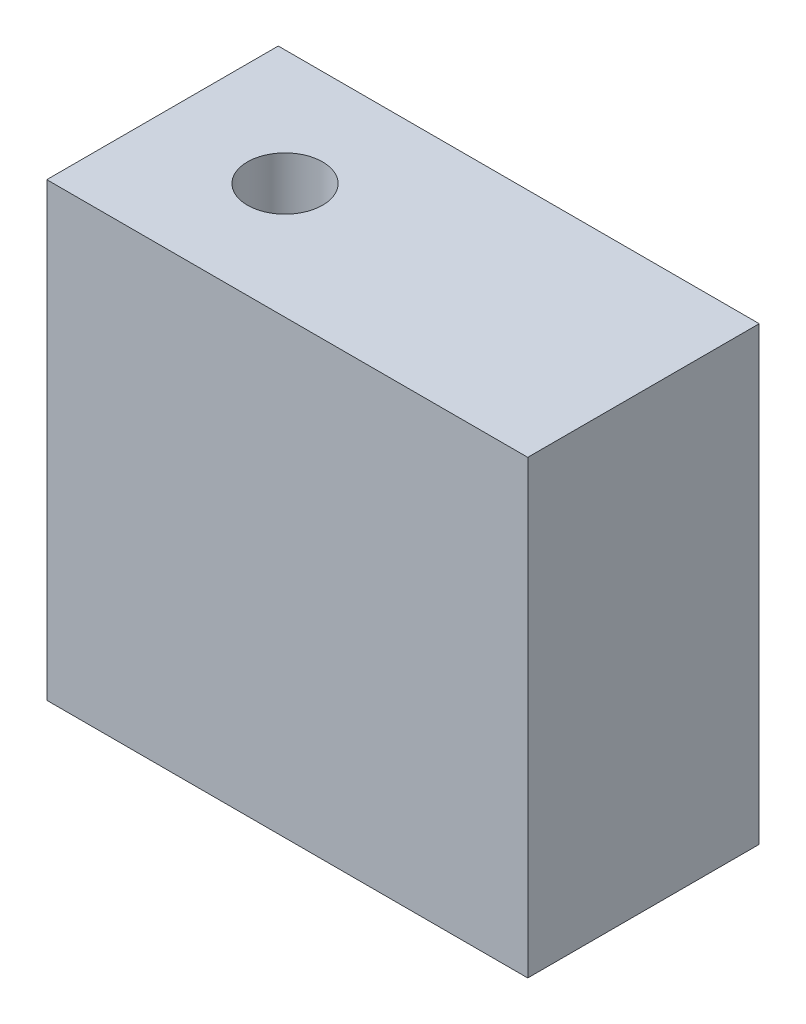
ISO-10303-21;
HEADER;
FILE_DESCRIPTION(('STEP AP214'),'2;1');
FILE_NAME('part.step','',(''),(''),'','','');
FILE_SCHEMA(('AUTOMOTIVE_DESIGN { 1 0 10303 214 1 1 1 1 }'));
ENDSEC;
DATA;
#1=APPLICATION_CONTEXT('core data for automotive mechanical design processes');
#2=APPLICATION_PROTOCOL_DEFINITION('international standard','automotive_design',2000,#1);
#3=PRODUCT_CONTEXT('',#1,'mechanical');
#4=PRODUCT('Part','Part','',(#3));
#5=PRODUCT_RELATED_PRODUCT_CATEGORY('part','',(#4));
#6=PRODUCT_DEFINITION_FORMATION('','',#4);
#7=PRODUCT_DEFINITION_CONTEXT('part definition',#1,'design');
#8=PRODUCT_DEFINITION('design','',#6,#7);
#9=PRODUCT_DEFINITION_SHAPE('','',#8);
#10=(LENGTH_UNIT() NAMED_UNIT(*) SI_UNIT(.MILLI.,.METRE.));
#11=(NAMED_UNIT(*) PLANE_ANGLE_UNIT() SI_UNIT($,.RADIAN.));
#12=(NAMED_UNIT(*) SI_UNIT($,.STERADIAN.) SOLID_ANGLE_UNIT());
#13=UNCERTAINTY_MEASURE_WITH_UNIT(LENGTH_MEASURE(1.E-05),#10,'distance_accuracy_value','');
#14=(GEOMETRIC_REPRESENTATION_CONTEXT(3) GLOBAL_UNCERTAINTY_ASSIGNED_CONTEXT((#13)) GLOBAL_UNIT_ASSIGNED_CONTEXT((#10,
#11,#12)) REPRESENTATION_CONTEXT('',''));
#15=CARTESIAN_POINT('',(0.,0.,0.));
#16=DIRECTION('',(0.,0.,1.));
#17=DIRECTION('',(1.,0.,0.));
#18=AXIS2_PLACEMENT_3D('',#15,#16,#17);
#19=CARTESIAN_POINT('',(0.,38.1,0.));
#20=DIRECTION('',(-1.,0.,0.));
#21=DIRECTION('',(0.,0.,1.));
#22=AXIS2_PLACEMENT_3D('',#19,#20,#21);
#23=PLANE('',#22);
#24=DIRECTION('',(0.,0.,-1.));
#25=VECTOR('',#24,1.);
#26=CARTESIAN_POINT('',(0.,0.,0.));
#27=LINE('',#26,#25);
#28=CARTESIAN_POINT('',(0.,0.,19.558));
#29=VERTEX_POINT('',#28);
#30=CARTESIAN_POINT('',(0.,0.,0.));
#31=VERTEX_POINT('',#30);
#32=EDGE_CURVE('E96',#29,#31,#27,.T.);
#33=ORIENTED_EDGE('',*,*,#32,.T.);
#34=DIRECTION('',(0.,-1.,0.));
#35=VECTOR('',#34,1.);
#36=CARTESIAN_POINT('',(0.,38.1,0.));
#37=LINE('',#36,#35);
#38=CARTESIAN_POINT('',(0.,38.1,0.));
#39=VERTEX_POINT('',#38);
#40=EDGE_CURVE('E11',#39,#31,#37,.T.);
#41=ORIENTED_EDGE('',*,*,#40,.F.);
#42=DIRECTION('',(0.,0.,-1.));
#43=VECTOR('',#42,1.);
#44=CARTESIAN_POINT('',(0.,38.1,0.));
#45=LINE('',#44,#43);
#46=CARTESIAN_POINT('',(0.,38.1,19.558));
#47=VERTEX_POINT('',#46);
#48=EDGE_CURVE('E84',#47,#39,#45,.T.);
#49=ORIENTED_EDGE('',*,*,#48,.F.);
#50=DIRECTION('',(0.,-1.,0.));
#51=VECTOR('',#50,1.);
#52=CARTESIAN_POINT('',(0.,38.1,19.558));
#53=LINE('',#52,#51);
#54=EDGE_CURVE('E92',#47,#29,#53,.T.);
#55=ORIENTED_EDGE('',*,*,#54,.T.);
#56=EDGE_LOOP('',(#33,#41,#49,#55));
#57=FACE_BOUND('',#56,.T.);
#58=ADVANCED_FACE('F33',(#57),#23,.F.);
#59=CARTESIAN_POINT('',(0.,38.1,0.));
#60=DIRECTION('',(0.,0.,1.));
#61=DIRECTION('',(1.,0.,0.));
#62=AXIS2_PLACEMENT_3D('',#59,#60,#61);
#63=PLANE('',#62);
#64=DIRECTION('',(-1.,0.,0.));
#65=VECTOR('',#64,1.);
#66=CARTESIAN_POINT('',(0.,0.,0.));
#67=LINE('',#66,#65);
#68=CARTESIAN_POINT('',(-40.64,0.,0.));
#69=VERTEX_POINT('',#68);
#70=EDGE_CURVE('E88',#31,#69,#67,.T.);
#71=ORIENTED_EDGE('',*,*,#70,.T.);
#72=DIRECTION('',(0.,-1.,0.));
#73=VECTOR('',#72,1.);
#74=CARTESIAN_POINT('',(-40.64,38.1,0.));
#75=LINE('',#74,#73);
#76=CARTESIAN_POINT('',(-40.64,38.1,0.));
#77=VERTEX_POINT('',#76);
#78=EDGE_CURVE('E41',#77,#69,#75,.T.);
#79=ORIENTED_EDGE('',*,*,#78,.F.);
#80=DIRECTION('',(-1.,0.,0.));
#81=VECTOR('',#80,1.);
#82=CARTESIAN_POINT('',(0.,38.1,0.));
#83=LINE('',#82,#81);
#84=EDGE_CURVE('E79',#39,#77,#83,.T.);
#85=ORIENTED_EDGE('',*,*,#84,.F.);
#86=ORIENTED_EDGE('',*,*,#40,.T.);
#87=EDGE_LOOP('',(#71,#79,#85,#86));
#88=FACE_BOUND('',#87,.T.);
#89=ADVANCED_FACE('F87',(#88),#63,.F.);
#90=CARTESIAN_POINT('',(-40.64,38.1,0.));
#91=DIRECTION('',(1.,0.,0.));
#92=DIRECTION('',(0.,0.,-1.));
#93=AXIS2_PLACEMENT_3D('',#90,#91,#92);
#94=PLANE('',#93);
#95=DIRECTION('',(0.,0.,1.));
#96=VECTOR('',#95,1.);
#97=CARTESIAN_POINT('',(-40.64,0.,0.));
#98=LINE('',#97,#96);
#99=CARTESIAN_POINT('',(-40.64,0.,19.558));
#100=VERTEX_POINT('',#99);
#101=EDGE_CURVE('E66',#69,#100,#98,.T.);
#102=ORIENTED_EDGE('',*,*,#101,.T.);
#103=DIRECTION('',(0.,-1.,0.));
#104=VECTOR('',#103,1.);
#105=CARTESIAN_POINT('',(-40.64,38.1,19.558));
#106=LINE('',#105,#104);
#107=CARTESIAN_POINT('',(-40.64,38.1,19.558));
#108=VERTEX_POINT('',#107);
#109=EDGE_CURVE('E89',#108,#100,#106,.T.);
#110=ORIENTED_EDGE('',*,*,#109,.F.);
#111=DIRECTION('',(0.,0.,1.));
#112=VECTOR('',#111,1.);
#113=CARTESIAN_POINT('',(-40.64,38.1,0.));
#114=LINE('',#113,#112);
#115=EDGE_CURVE('E82',#77,#108,#114,.T.);
#116=ORIENTED_EDGE('',*,*,#115,.F.);
#117=ORIENTED_EDGE('',*,*,#78,.T.);
#118=EDGE_LOOP('',(#102,#110,#116,#117));
#119=FACE_BOUND('',#118,.T.);
#120=ADVANCED_FACE('F90',(#119),#94,.F.);
#121=CARTESIAN_POINT('',(0.,38.1,19.558));
#122=DIRECTION('',(0.,0.,-1.));
#123=DIRECTION('',(-1.,0.,0.));
#124=AXIS2_PLACEMENT_3D('',#121,#122,#123);
#125=PLANE('',#124);
#126=DIRECTION('',(1.,0.,0.));
#127=VECTOR('',#126,1.);
#128=CARTESIAN_POINT('',(0.,0.,19.558));
#129=LINE('',#128,#127);
#130=EDGE_CURVE('E72',#100,#29,#129,.T.);
#131=ORIENTED_EDGE('',*,*,#130,.T.);
#132=ORIENTED_EDGE('',*,*,#54,.F.);
#133=DIRECTION('',(1.,0.,0.));
#134=VECTOR('',#133,1.);
#135=CARTESIAN_POINT('',(0.,38.1,19.558));
#136=LINE('',#135,#134);
#137=EDGE_CURVE('E49',#108,#47,#136,.T.);
#138=ORIENTED_EDGE('',*,*,#137,.F.);
#139=ORIENTED_EDGE('',*,*,#109,.T.);
#140=EDGE_LOOP('',(#131,#132,#138,#139));
#141=FACE_BOUND('',#140,.T.);
#142=ADVANCED_FACE('F104',(#141),#125,.F.);
#143=CARTESIAN_POINT('',(0.,38.1,0.));
#144=DIRECTION('',(0.,-1.,0.));
#145=DIRECTION('',(0.,0.,-1.));
#146=AXIS2_PLACEMENT_3D('',#143,#144,#145);
#147=PLANE('',#146);
#148=CARTESIAN_POINT('',(-30.2895,38.1,9.779));
#149=DIRECTION('',(0.,1.,0.));
#150=DIRECTION('',(0.,0.,1.));
#151=AXIS2_PLACEMENT_3D('',#148,#149,#150);
#152=CIRCLE('',#151,3.175);
#153=CARTESIAN_POINT('',(-30.2895,38.1,12.954));
#154=VERTEX_POINT('',#153);
#155=EDGE_CURVE('E110',#154,#154,#152,.T.);
#156=ORIENTED_EDGE('',*,*,#155,.F.);
#157=EDGE_LOOP('',(#156));
#158=FACE_BOUND('',#157,.T.);
#159=ORIENTED_EDGE('',*,*,#48,.T.);
#160=ORIENTED_EDGE('',*,*,#84,.T.);
#161=ORIENTED_EDGE('',*,*,#115,.T.);
#162=ORIENTED_EDGE('',*,*,#137,.T.);
#163=EDGE_LOOP('',(#159,#160,#161,#162));
#164=FACE_BOUND('',#163,.T.);
#165=ADVANCED_FACE('F80',(#158,#164),#147,.F.);
#166=CARTESIAN_POINT('',(0.,0.,0.));
#167=DIRECTION('',(0.,-1.,0.));
#168=DIRECTION('',(0.,0.,-1.));
#169=AXIS2_PLACEMENT_3D('',#166,#167,#168);
#170=PLANE('',#169);
#171=ORIENTED_EDGE('',*,*,#32,.F.);
#172=ORIENTED_EDGE('',*,*,#130,.F.);
#173=ORIENTED_EDGE('',*,*,#101,.F.);
#174=ORIENTED_EDGE('',*,*,#70,.F.);
#175=EDGE_LOOP('',(#171,#172,#173,#174));
#176=FACE_BOUND('',#175,.T.);
#177=ADVANCED_FACE('F107',(#176),#170,.T.);
#178=CARTESIAN_POINT('',(-30.2895,25.4,9.779));
#179=DIRECTION('',(0.,1.,0.));
#180=DIRECTION('',(0.,0.,1.));
#181=AXIS2_PLACEMENT_3D('',#178,#179,#180);
#182=CYLINDRICAL_SURFACE('',#181,3.175);
#183=CARTESIAN_POINT('',(-30.2895,25.4,9.779));
#184=DIRECTION('',(0.,1.,0.));
#185=DIRECTION('',(0.,0.,1.));
#186=AXIS2_PLACEMENT_3D('',#183,#184,#185);
#187=CIRCLE('',#186,3.175);
#188=CARTESIAN_POINT('',(-30.2895,25.4,12.954));
#189=VERTEX_POINT('',#188);
#190=EDGE_CURVE('E99',#189,#189,#187,.T.);
#191=ORIENTED_EDGE('',*,*,#190,.F.);
#192=EDGE_LOOP('',(#191));
#193=FACE_BOUND('',#192,.T.);
#194=ORIENTED_EDGE('',*,*,#155,.T.);
#195=EDGE_LOOP('',(#194));
#196=FACE_BOUND('',#195,.T.);
#197=ADVANCED_FACE('F118',(#193,#196),#182,.F.);
#198=CARTESIAN_POINT('',(-30.2895,25.4,9.779));
#199=DIRECTION('',(0.,1.,0.));
#200=DIRECTION('',(0.,0.,1.));
#201=AXIS2_PLACEMENT_3D('',#198,#199,#200);
#202=PLANE('',#201);
#203=ORIENTED_EDGE('',*,*,#190,.T.);
#204=EDGE_LOOP('',(#203));
#205=FACE_BOUND('',#204,.T.);
#206=ADVANCED_FACE('F116',(#205),#202,.T.);
#207=CLOSED_SHELL('',(#58,#89,#120,#142,#165,#177,#197,#206));
#208=MANIFOLD_SOLID_BREP('B2',#207);
#209=ADVANCED_BREP_SHAPE_REPRESENTATION('',(#18,#208),#14);
#210=SHAPE_DEFINITION_REPRESENTATION(#9,#209);
ENDSEC;
END-ISO-10303-21;
